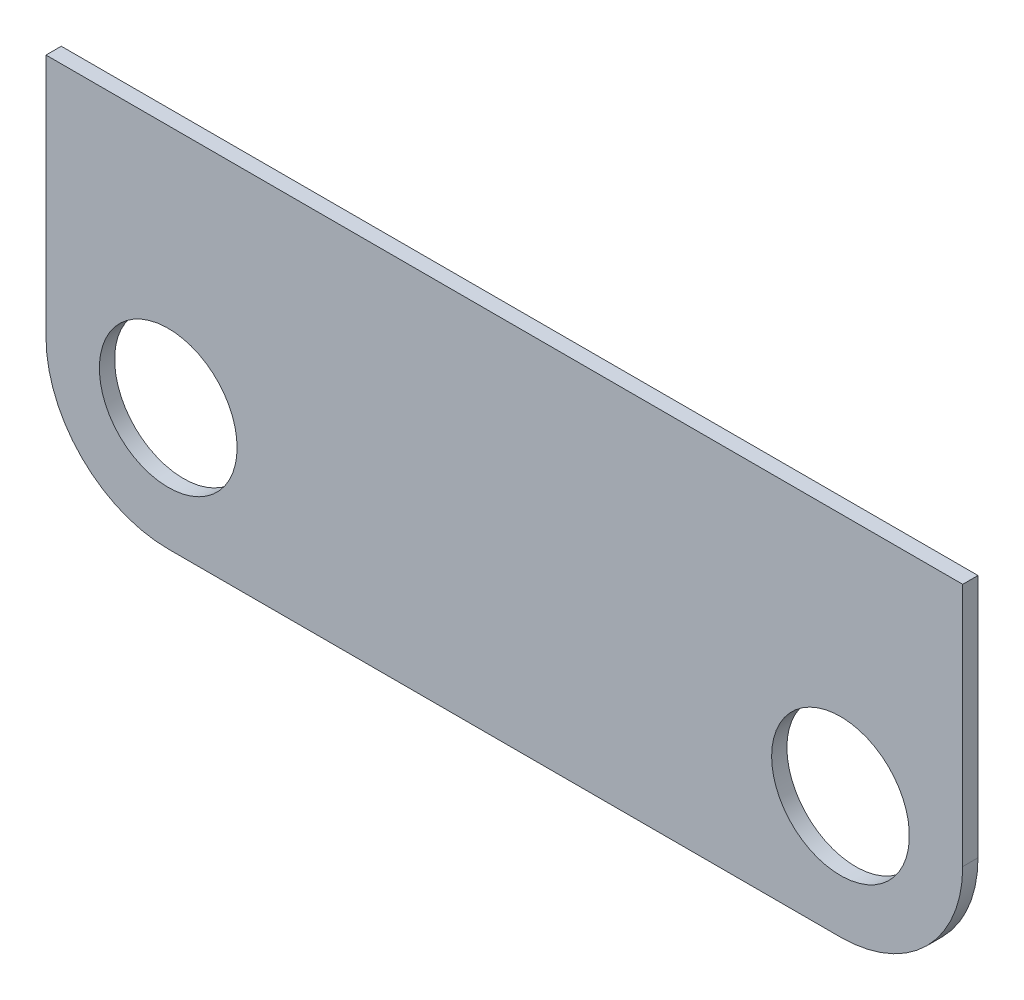
ISO-10303-21;
HEADER;
FILE_DESCRIPTION(('STEP AP214'),'2;1');
FILE_NAME('part.step','',(''),(''),'','','');
FILE_SCHEMA(('AUTOMOTIVE_DESIGN { 1 0 10303 214 1 1 1 1 }'));
ENDSEC;
DATA;
#1=APPLICATION_CONTEXT('core data for automotive mechanical design processes');
#2=APPLICATION_PROTOCOL_DEFINITION('international standard','automotive_design',2000,#1);
#3=PRODUCT_CONTEXT('',#1,'mechanical');
#4=PRODUCT('Part','Part','',(#3));
#5=PRODUCT_RELATED_PRODUCT_CATEGORY('part','',(#4));
#6=PRODUCT_DEFINITION_FORMATION('','',#4);
#7=PRODUCT_DEFINITION_CONTEXT('part definition',#1,'design');
#8=PRODUCT_DEFINITION('design','',#6,#7);
#9=PRODUCT_DEFINITION_SHAPE('','',#8);
#10=(LENGTH_UNIT() NAMED_UNIT(*) SI_UNIT(.MILLI.,.METRE.));
#11=(NAMED_UNIT(*) PLANE_ANGLE_UNIT() SI_UNIT($,.RADIAN.));
#12=(NAMED_UNIT(*) SI_UNIT($,.STERADIAN.) SOLID_ANGLE_UNIT());
#13=UNCERTAINTY_MEASURE_WITH_UNIT(LENGTH_MEASURE(1.E-05),#10,'distance_accuracy_value','');
#14=(GEOMETRIC_REPRESENTATION_CONTEXT(3) GLOBAL_UNCERTAINTY_ASSIGNED_CONTEXT((#13)) GLOBAL_UNIT_ASSIGNED_CONTEXT((#10,
#11,#12)) REPRESENTATION_CONTEXT('',''));
#15=CARTESIAN_POINT('',(0.,0.,0.));
#16=DIRECTION('',(0.,0.,1.));
#17=DIRECTION('',(1.,0.,0.));
#18=AXIS2_PLACEMENT_3D('',#15,#16,#17);
#19=CARTESIAN_POINT('',(69.85,-12.7,3.175));
#20=DIRECTION('',(0.,0.,1.));
#21=DIRECTION('',(1.,0.,0.));
#22=AXIS2_PLACEMENT_3D('',#19,#20,#21);
#23=PLANE('',#22);
#24=CARTESIAN_POINT('',(-69.85,-12.7,3.175));
#25=DIRECTION('',(0.,0.,1.));
#26=DIRECTION('',(1.,0.,0.));
#27=AXIS2_PLACEMENT_3D('',#24,#25,#26);
#28=CIRCLE('',#27,14.3129);
#29=CARTESIAN_POINT('',(-55.5371,-12.7,3.175));
#30=VERTEX_POINT('',#29);
#31=EDGE_CURVE('E126',#30,#30,#28,.T.);
#32=ORIENTED_EDGE('',*,*,#31,.F.);
#33=EDGE_LOOP('',(#32));
#34=FACE_BOUND('',#33,.T.);
#35=DIRECTION('',(0.,-1.,0.));
#36=VECTOR('',#35,1.);
#37=CARTESIAN_POINT('',(-95.25,-12.6999999999998,3.175));
#38=LINE('',#37,#36);
#39=CARTESIAN_POINT('',(-95.25,38.1,3.175));
#40=VERTEX_POINT('',#39);
#41=CARTESIAN_POINT('',(-95.25,-12.7,3.175));
#42=VERTEX_POINT('',#41);
#43=EDGE_CURVE('E133',#40,#42,#38,.T.);
#44=ORIENTED_EDGE('',*,*,#43,.T.);
#45=CARTESIAN_POINT('',(-69.85,-12.7,3.175));
#46=DIRECTION('',(0.,0.,1.));
#47=DIRECTION('',(-1.,0.,0.));
#48=AXIS2_PLACEMENT_3D('',#45,#46,#47);
#49=CIRCLE('',#48,25.4);
#50=CARTESIAN_POINT('',(-69.8499999999998,-38.1,3.175));
#51=VERTEX_POINT('',#50);
#52=EDGE_CURVE('E91',#42,#51,#49,.T.);
#53=ORIENTED_EDGE('',*,*,#52,.T.);
#54=DIRECTION('',(1.,0.,0.));
#55=VECTOR('',#54,1.);
#56=CARTESIAN_POINT('',(69.8499999999998,-38.1,3.175));
#57=LINE('',#56,#55);
#58=CARTESIAN_POINT('',(69.8499999999998,-38.1,3.175));
#59=VERTEX_POINT('',#58);
#60=EDGE_CURVE('E104',#51,#59,#57,.T.);
#61=ORIENTED_EDGE('',*,*,#60,.T.);
#62=CARTESIAN_POINT('',(69.85,-12.7,3.175));
#63=DIRECTION('',(0.,0.,1.));
#64=DIRECTION('',(1.,0.,0.));
#65=AXIS2_PLACEMENT_3D('',#62,#63,#64);
#66=CIRCLE('',#65,25.4);
#67=CARTESIAN_POINT('',(95.25,-12.6999999999998,3.175));
#68=VERTEX_POINT('',#67);
#69=EDGE_CURVE('E98',#59,#68,#66,.T.);
#70=ORIENTED_EDGE('',*,*,#69,.T.);
#71=DIRECTION('',(0.,1.,0.));
#72=VECTOR('',#71,1.);
#73=CARTESIAN_POINT('',(95.25,-12.6999999999998,3.175));
#74=LINE('',#73,#72);
#75=CARTESIAN_POINT('',(95.25,38.1,3.175));
#76=VERTEX_POINT('',#75);
#77=EDGE_CURVE('E102',#68,#76,#74,.T.);
#78=ORIENTED_EDGE('',*,*,#77,.T.);
#79=DIRECTION('',(-1.,0.,0.));
#80=VECTOR('',#79,1.);
#81=CARTESIAN_POINT('',(95.25,38.1,3.175));
#82=LINE('',#81,#80);
#83=EDGE_CURVE('E54',#76,#40,#82,.T.);
#84=ORIENTED_EDGE('',*,*,#83,.T.);
#85=EDGE_LOOP('',(#44,#53,#61,#70,#78,#84));
#86=FACE_BOUND('',#85,.T.);
#87=CARTESIAN_POINT('',(69.85,-12.7,3.175));
#88=DIRECTION('',(0.,0.,1.));
#89=DIRECTION('',(-1.,0.,0.));
#90=AXIS2_PLACEMENT_3D('',#87,#88,#89);
#91=CIRCLE('',#90,14.3129);
#92=CARTESIAN_POINT('',(55.5371,-12.7,3.175));
#93=VERTEX_POINT('',#92);
#94=EDGE_CURVE('E175',#93,#93,#91,.T.);
#95=ORIENTED_EDGE('',*,*,#94,.F.);
#96=EDGE_LOOP('',(#95));
#97=FACE_BOUND('',#96,.T.);
#98=ADVANCED_FACE('F37',(#34,#86,#97),#23,.T.);
#99=CARTESIAN_POINT('',(69.85,-12.7,0.));
#100=DIRECTION('',(0.,0.,1.));
#101=DIRECTION('',(1.,0.,0.));
#102=AXIS2_PLACEMENT_3D('',#99,#100,#101);
#103=PLANE('',#102);
#104=DIRECTION('',(0.,-1.,0.));
#105=VECTOR('',#104,1.);
#106=CARTESIAN_POINT('',(-95.25,-12.6999999999998,0.));
#107=LINE('',#106,#105);
#108=CARTESIAN_POINT('',(-95.25,38.1,0.));
#109=VERTEX_POINT('',#108);
#110=CARTESIAN_POINT('',(-95.25,-12.7,0.));
#111=VERTEX_POINT('',#110);
#112=EDGE_CURVE('E122',#109,#111,#107,.T.);
#113=ORIENTED_EDGE('',*,*,#112,.F.);
#114=DIRECTION('',(-1.,0.,0.));
#115=VECTOR('',#114,1.);
#116=CARTESIAN_POINT('',(95.25,38.1,0.));
#117=LINE('',#116,#115);
#118=CARTESIAN_POINT('',(95.25,38.1,0.));
#119=VERTEX_POINT('',#118);
#120=EDGE_CURVE('E83',#119,#109,#117,.T.);
#121=ORIENTED_EDGE('',*,*,#120,.F.);
#122=DIRECTION('',(0.,1.,0.));
#123=VECTOR('',#122,1.);
#124=CARTESIAN_POINT('',(95.25,-12.6999999999998,0.));
#125=LINE('',#124,#123);
#126=CARTESIAN_POINT('',(95.25,-12.6999999999998,0.));
#127=VERTEX_POINT('',#126);
#128=EDGE_CURVE('E77',#127,#119,#125,.T.);
#129=ORIENTED_EDGE('',*,*,#128,.F.);
#130=CARTESIAN_POINT('',(69.85,-12.7,0.));
#131=DIRECTION('',(0.,0.,1.));
#132=DIRECTION('',(1.,0.,0.));
#133=AXIS2_PLACEMENT_3D('',#130,#131,#132);
#134=CIRCLE('',#133,25.4);
#135=CARTESIAN_POINT('',(69.8499999999998,-38.1,0.));
#136=VERTEX_POINT('',#135);
#137=EDGE_CURVE('E112',#136,#127,#134,.T.);
#138=ORIENTED_EDGE('',*,*,#137,.F.);
#139=DIRECTION('',(1.,0.,0.));
#140=VECTOR('',#139,1.);
#141=CARTESIAN_POINT('',(69.8499999999998,-38.1,0.));
#142=LINE('',#141,#140);
#143=CARTESIAN_POINT('',(-69.8499999999998,-38.1,0.));
#144=VERTEX_POINT('',#143);
#145=EDGE_CURVE('E128',#144,#136,#142,.T.);
#146=ORIENTED_EDGE('',*,*,#145,.F.);
#147=CARTESIAN_POINT('',(-69.85,-12.7,0.));
#148=DIRECTION('',(0.,0.,1.));
#149=DIRECTION('',(-1.,0.,0.));
#150=AXIS2_PLACEMENT_3D('',#147,#148,#149);
#151=CIRCLE('',#150,25.4);
#152=EDGE_CURVE('E125',#111,#144,#151,.T.);
#153=ORIENTED_EDGE('',*,*,#152,.F.);
#154=EDGE_LOOP('',(#113,#121,#129,#138,#146,#153));
#155=FACE_BOUND('',#154,.T.);
#156=CARTESIAN_POINT('',(-69.85,-12.7,0.));
#157=DIRECTION('',(0.,0.,1.));
#158=DIRECTION('',(1.,0.,0.));
#159=AXIS2_PLACEMENT_3D('',#156,#157,#158);
#160=CIRCLE('',#159,14.3129);
#161=CARTESIAN_POINT('',(-55.5371,-12.7,0.));
#162=VERTEX_POINT('',#161);
#163=EDGE_CURVE('E181',#162,#162,#160,.T.);
#164=ORIENTED_EDGE('',*,*,#163,.T.);
#165=EDGE_LOOP('',(#164));
#166=FACE_BOUND('',#165,.T.);
#167=CARTESIAN_POINT('',(69.85,-12.7,0.));
#168=DIRECTION('',(0.,0.,1.));
#169=DIRECTION('',(-1.,0.,0.));
#170=AXIS2_PLACEMENT_3D('',#167,#168,#169);
#171=CIRCLE('',#170,14.3129);
#172=CARTESIAN_POINT('',(55.5371,-12.7,0.));
#173=VERTEX_POINT('',#172);
#174=EDGE_CURVE('E178',#173,#173,#171,.T.);
#175=ORIENTED_EDGE('',*,*,#174,.T.);
#176=EDGE_LOOP('',(#175));
#177=FACE_BOUND('',#176,.T.);
#178=ADVANCED_FACE('F142',(#155,#166,#177),#103,.F.);
#179=CARTESIAN_POINT('',(-95.25,-12.6999999999998,3.175));
#180=DIRECTION('',(1.,0.,0.));
#181=DIRECTION('',(0.,0.,-1.));
#182=AXIS2_PLACEMENT_3D('',#179,#180,#181);
#183=PLANE('',#182);
#184=ORIENTED_EDGE('',*,*,#112,.T.);
#185=DIRECTION('',(0.,0.,-1.));
#186=VECTOR('',#185,1.);
#187=CARTESIAN_POINT('',(-95.25,-12.7,3.175));
#188=LINE('',#187,#186);
#189=EDGE_CURVE('E11',#42,#111,#188,.T.);
#190=ORIENTED_EDGE('',*,*,#189,.F.);
#191=ORIENTED_EDGE('',*,*,#43,.F.);
#192=DIRECTION('',(0.,0.,-1.));
#193=VECTOR('',#192,1.);
#194=CARTESIAN_POINT('',(-95.25,38.1,3.175));
#195=LINE('',#194,#193);
#196=EDGE_CURVE('E118',#40,#109,#195,.T.);
#197=ORIENTED_EDGE('',*,*,#196,.T.);
#198=EDGE_LOOP('',(#184,#190,#191,#197));
#199=FACE_BOUND('',#198,.T.);
#200=ADVANCED_FACE('F39',(#199),#183,.F.);
#201=CARTESIAN_POINT('',(-69.85,-12.7,3.175));
#202=DIRECTION('',(0.,0.,-1.));
#203=DIRECTION('',(-1.,0.,0.));
#204=AXIS2_PLACEMENT_3D('',#201,#202,#203);
#205=CYLINDRICAL_SURFACE('',#204,25.4);
#206=ORIENTED_EDGE('',*,*,#152,.T.);
#207=DIRECTION('',(0.,0.,-1.));
#208=VECTOR('',#207,1.);
#209=CARTESIAN_POINT('',(-69.8499999999998,-38.1,3.175));
#210=LINE('',#209,#208);
#211=EDGE_CURVE('E46',#51,#144,#210,.T.);
#212=ORIENTED_EDGE('',*,*,#211,.F.);
#213=ORIENTED_EDGE('',*,*,#52,.F.);
#214=ORIENTED_EDGE('',*,*,#189,.T.);
#215=EDGE_LOOP('',(#206,#212,#213,#214));
#216=FACE_BOUND('',#215,.T.);
#217=ADVANCED_FACE('F226',(#216),#205,.T.);
#218=CARTESIAN_POINT('',(69.8499999999998,-38.1,3.175));
#219=DIRECTION('',(0.,1.,0.));
#220=DIRECTION('',(-1.,0.,0.));
#221=AXIS2_PLACEMENT_3D('',#218,#219,#220);
#222=PLANE('',#221);
#223=ORIENTED_EDGE('',*,*,#145,.T.);
#224=DIRECTION('',(0.,0.,-1.));
#225=VECTOR('',#224,1.);
#226=CARTESIAN_POINT('',(69.8499999999998,-38.1,3.175));
#227=LINE('',#226,#225);
#228=EDGE_CURVE('E113',#59,#136,#227,.T.);
#229=ORIENTED_EDGE('',*,*,#228,.F.);
#230=ORIENTED_EDGE('',*,*,#60,.F.);
#231=ORIENTED_EDGE('',*,*,#211,.T.);
#232=EDGE_LOOP('',(#223,#229,#230,#231));
#233=FACE_BOUND('',#232,.T.);
#234=ADVANCED_FACE('F139',(#233),#222,.F.);
#235=CARTESIAN_POINT('',(69.85,-12.7,3.175));
#236=DIRECTION('',(0.,0.,-1.));
#237=DIRECTION('',(-1.,0.,0.));
#238=AXIS2_PLACEMENT_3D('',#235,#236,#237);
#239=CYLINDRICAL_SURFACE('',#238,25.4);
#240=ORIENTED_EDGE('',*,*,#137,.T.);
#241=DIRECTION('',(0.,0.,-1.));
#242=VECTOR('',#241,1.);
#243=CARTESIAN_POINT('',(95.25,-12.6999999999998,3.175));
#244=LINE('',#243,#242);
#245=EDGE_CURVE('E109',#68,#127,#244,.T.);
#246=ORIENTED_EDGE('',*,*,#245,.F.);
#247=ORIENTED_EDGE('',*,*,#69,.F.);
#248=ORIENTED_EDGE('',*,*,#228,.T.);
#249=EDGE_LOOP('',(#240,#246,#247,#248));
#250=FACE_BOUND('',#249,.T.);
#251=ADVANCED_FACE('F110',(#250),#239,.T.);
#252=CARTESIAN_POINT('',(95.25,-12.6999999999998,3.175));
#253=DIRECTION('',(-1.,0.,0.));
#254=DIRECTION('',(0.,0.,1.));
#255=AXIS2_PLACEMENT_3D('',#252,#253,#254);
#256=PLANE('',#255);
#257=ORIENTED_EDGE('',*,*,#128,.T.);
#258=DIRECTION('',(0.,0.,-1.));
#259=VECTOR('',#258,1.);
#260=CARTESIAN_POINT('',(95.25,38.1,3.175));
#261=LINE('',#260,#259);
#262=EDGE_CURVE('E114',#76,#119,#261,.T.);
#263=ORIENTED_EDGE('',*,*,#262,.F.);
#264=ORIENTED_EDGE('',*,*,#77,.F.);
#265=ORIENTED_EDGE('',*,*,#245,.T.);
#266=EDGE_LOOP('',(#257,#263,#264,#265));
#267=FACE_BOUND('',#266,.T.);
#268=ADVANCED_FACE('F116',(#267),#256,.F.);
#269=CARTESIAN_POINT('',(95.25,38.1,3.175));
#270=DIRECTION('',(0.,-1.,0.));
#271=DIRECTION('',(1.,0.,0.));
#272=AXIS2_PLACEMENT_3D('',#269,#270,#271);
#273=PLANE('',#272);
#274=ORIENTED_EDGE('',*,*,#120,.T.);
#275=ORIENTED_EDGE('',*,*,#196,.F.);
#276=ORIENTED_EDGE('',*,*,#83,.F.);
#277=ORIENTED_EDGE('',*,*,#262,.T.);
#278=EDGE_LOOP('',(#274,#275,#276,#277));
#279=FACE_BOUND('',#278,.T.);
#280=ADVANCED_FACE('F147',(#279),#273,.F.);
#281=CARTESIAN_POINT('',(-69.85,-12.7,3.175));
#282=DIRECTION('',(0.,0.,-1.));
#283=DIRECTION('',(-1.,0.,0.));
#284=AXIS2_PLACEMENT_3D('',#281,#282,#283);
#285=CYLINDRICAL_SURFACE('',#284,14.3129);
#286=ORIENTED_EDGE('',*,*,#31,.T.);
#287=EDGE_LOOP('',(#286));
#288=FACE_BOUND('',#287,.T.);
#289=ORIENTED_EDGE('',*,*,#163,.F.);
#290=EDGE_LOOP('',(#289));
#291=FACE_BOUND('',#290,.T.);
#292=ADVANCED_FACE('F149',(#288,#291),#285,.F.);
#293=CARTESIAN_POINT('',(69.85,-12.7,3.175));
#294=DIRECTION('',(0.,0.,-1.));
#295=DIRECTION('',(-1.,0.,0.));
#296=AXIS2_PLACEMENT_3D('',#293,#294,#295);
#297=CYLINDRICAL_SURFACE('',#296,14.3129);
#298=ORIENTED_EDGE('',*,*,#94,.T.);
#299=EDGE_LOOP('',(#298));
#300=FACE_BOUND('',#299,.T.);
#301=ORIENTED_EDGE('',*,*,#174,.F.);
#302=EDGE_LOOP('',(#301));
#303=FACE_BOUND('',#302,.T.);
#304=ADVANCED_FACE('F155',(#300,#303),#297,.F.);
#305=CLOSED_SHELL('',(#98,#178,#200,#217,#234,#251,#268,#280,#292,#304));
#306=MANIFOLD_SOLID_BREP('B2',#305);
#307=ADVANCED_BREP_SHAPE_REPRESENTATION('',(#18,#306),#14);
#308=SHAPE_DEFINITION_REPRESENTATION(#9,#307);
ENDSEC;
END-ISO-10303-21;
